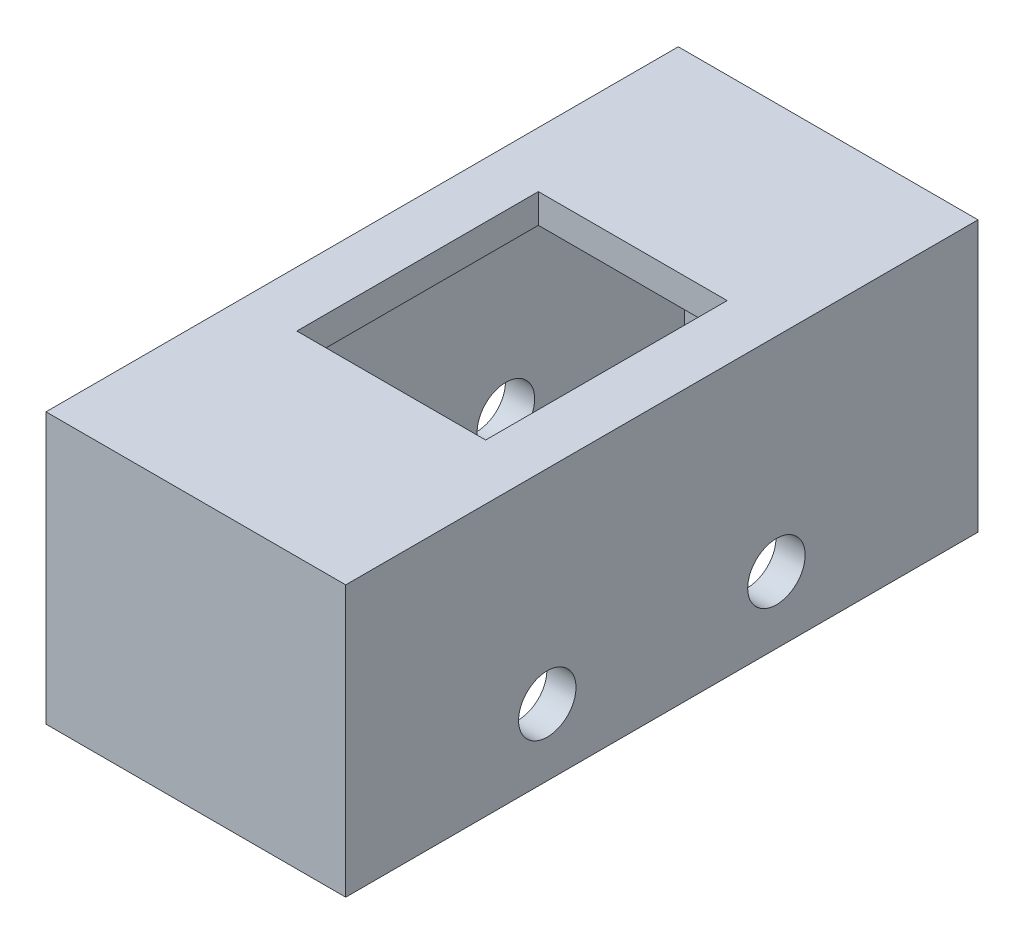
ISO-10303-21;
HEADER;
FILE_DESCRIPTION(('STEP AP214'),'2;1');
FILE_NAME('part.step','',(''),(''),'','','');
FILE_SCHEMA(('AUTOMOTIVE_DESIGN { 1 0 10303 214 1 1 1 1 }'));
ENDSEC;
DATA;
#1=APPLICATION_CONTEXT('core data for automotive mechanical design processes');
#2=APPLICATION_PROTOCOL_DEFINITION('international standard','automotive_design',2000,#1);
#3=PRODUCT_CONTEXT('',#1,'mechanical');
#4=PRODUCT('Part','Part','',(#3));
#5=PRODUCT_RELATED_PRODUCT_CATEGORY('part','',(#4));
#6=PRODUCT_DEFINITION_FORMATION('','',#4);
#7=PRODUCT_DEFINITION_CONTEXT('part definition',#1,'design');
#8=PRODUCT_DEFINITION('design','',#6,#7);
#9=PRODUCT_DEFINITION_SHAPE('','',#8);
#10=(LENGTH_UNIT() NAMED_UNIT(*) SI_UNIT(.MILLI.,.METRE.));
#11=(NAMED_UNIT(*) PLANE_ANGLE_UNIT() SI_UNIT($,.RADIAN.));
#12=(NAMED_UNIT(*) SI_UNIT($,.STERADIAN.) SOLID_ANGLE_UNIT());
#13=UNCERTAINTY_MEASURE_WITH_UNIT(LENGTH_MEASURE(1.E-05),#10,'distance_accuracy_value','');
#14=(GEOMETRIC_REPRESENTATION_CONTEXT(3) GLOBAL_UNCERTAINTY_ASSIGNED_CONTEXT((#13)) GLOBAL_UNIT_ASSIGNED_CONTEXT((#10,
#11,#12)) REPRESENTATION_CONTEXT('',''));
#15=CARTESIAN_POINT('',(0.,0.,0.));
#16=DIRECTION('',(0.,0.,1.));
#17=DIRECTION('',(1.,0.,0.));
#18=AXIS2_PLACEMENT_3D('',#15,#16,#17);
#19=CARTESIAN_POINT('',(-13.04,21.,-27.5083720930232));
#20=DIRECTION('',(0.,-1.,0.));
#21=DIRECTION('',(0.,0.,-1.));
#22=AXIS2_PLACEMENT_3D('',#19,#20,#21);
#23=PLANE('',#22);
#24=DIRECTION('',(0.,0.,-1.));
#25=VECTOR('',#24,1.);
#26=CARTESIAN_POINT('',(10.5,21.,-25.5));
#27=LINE('',#26,#25);
#28=CARTESIAN_POINT('',(10.5,21.,25.5));
#29=VERTEX_POINT('',#28);
#30=CARTESIAN_POINT('',(10.5,21.,-25.5));
#31=VERTEX_POINT('',#30);
#32=EDGE_CURVE('E167',#29,#31,#27,.T.);
#33=ORIENTED_EDGE('',*,*,#32,.F.);
#34=DIRECTION('',(1.,0.,0.));
#35=VECTOR('',#34,1.);
#36=CARTESIAN_POINT('',(-10.5,21.,25.5));
#37=LINE('',#36,#35);
#38=CARTESIAN_POINT('',(-10.5,21.,25.5));
#39=VERTEX_POINT('',#38);
#40=EDGE_CURVE('E177',#39,#29,#37,.T.);
#41=ORIENTED_EDGE('',*,*,#40,.F.);
#42=DIRECTION('',(0.,0.,1.));
#43=VECTOR('',#42,1.);
#44=CARTESIAN_POINT('',(-10.5,21.,-25.5));
#45=LINE('',#44,#43);
#46=CARTESIAN_POINT('',(-10.5,21.,-25.5));
#47=VERTEX_POINT('',#46);
#48=EDGE_CURVE('E174',#47,#39,#45,.T.);
#49=ORIENTED_EDGE('',*,*,#48,.F.);
#50=DIRECTION('',(-1.,0.,0.));
#51=VECTOR('',#50,1.);
#52=CARTESIAN_POINT('',(-10.5,21.,-25.5));
#53=LINE('',#52,#51);
#54=EDGE_CURVE('E170',#31,#47,#53,.T.);
#55=ORIENTED_EDGE('',*,*,#54,.F.);
#56=EDGE_LOOP('',(#33,#41,#49,#55));
#57=FACE_BOUND('',#56,.T.);
#58=DIRECTION('',(-1.,0.,0.));
#59=VECTOR('',#58,1.);
#60=CARTESIAN_POINT('',(-8.214,21.,-10.5083720930232));
#61=LINE('',#60,#59);
#62=CARTESIAN_POINT('',(8.21400000000001,21.,-10.5083720930232));
#63=VERTEX_POINT('',#62);
#64=CARTESIAN_POINT('',(-8.214,21.,-10.5083720930232));
#65=VERTEX_POINT('',#64);
#66=EDGE_CURVE('E137',#63,#65,#61,.T.);
#67=ORIENTED_EDGE('',*,*,#66,.T.);
#68=DIRECTION('',(0.,0.,1.));
#69=VECTOR('',#68,1.);
#70=CARTESIAN_POINT('',(-8.214,21.,-10.5083720930232));
#71=LINE('',#70,#69);
#72=CARTESIAN_POINT('',(-8.214,21.,10.5083720930232));
#73=VERTEX_POINT('',#72);
#74=EDGE_CURVE('E132',#65,#73,#71,.T.);
#75=ORIENTED_EDGE('',*,*,#74,.T.);
#76=DIRECTION('',(1.,0.,0.));
#77=VECTOR('',#76,1.);
#78=CARTESIAN_POINT('',(-8.214,21.,10.5083720930232));
#79=LINE('',#78,#77);
#80=CARTESIAN_POINT('',(8.21400000000001,21.,10.5083720930232));
#81=VERTEX_POINT('',#80);
#82=EDGE_CURVE('E121',#73,#81,#79,.T.);
#83=ORIENTED_EDGE('',*,*,#82,.T.);
#84=DIRECTION('',(0.,0.,-1.));
#85=VECTOR('',#84,1.);
#86=CARTESIAN_POINT('',(8.21400000000001,21.,-10.5083720930232));
#87=LINE('',#86,#85);
#88=EDGE_CURVE('E141',#81,#63,#87,.T.);
#89=ORIENTED_EDGE('',*,*,#88,.T.);
#90=EDGE_LOOP('',(#67,#75,#83,#89));
#91=FACE_BOUND('',#90,.T.);
#92=ADVANCED_FACE('F33',(#57,#91),#23,.T.);
#93=CARTESIAN_POINT('',(0.,0.,0.));
#94=DIRECTION('',(0.,-1.,0.));
#95=DIRECTION('',(0.,0.,-1.));
#96=AXIS2_PLACEMENT_3D('',#93,#94,#95);
#97=PLANE('',#96);
#98=DIRECTION('',(0.,0.,-1.));
#99=VECTOR('',#98,1.);
#100=CARTESIAN_POINT('',(13.04,0.,27.5083720930232));
#101=LINE('',#100,#99);
#102=CARTESIAN_POINT('',(13.04,0.,27.5083720930232));
#103=VERTEX_POINT('',#102);
#104=CARTESIAN_POINT('',(13.04,0.,-27.5083720930232));
#105=VERTEX_POINT('',#104);
#106=EDGE_CURVE('E200',#103,#105,#101,.T.);
#107=ORIENTED_EDGE('',*,*,#106,.F.);
#108=DIRECTION('',(1.,0.,0.));
#109=VECTOR('',#108,1.);
#110=CARTESIAN_POINT('',(-13.04,0.,27.5083720930232));
#111=LINE('',#110,#109);
#112=CARTESIAN_POINT('',(-13.04,0.,27.5083720930232));
#113=VERTEX_POINT('',#112);
#114=EDGE_CURVE('E207',#113,#103,#111,.T.);
#115=ORIENTED_EDGE('',*,*,#114,.F.);
#116=DIRECTION('',(0.,0.,1.));
#117=VECTOR('',#116,1.);
#118=CARTESIAN_POINT('',(-13.04,0.,27.5083720930232));
#119=LINE('',#118,#117);
#120=CARTESIAN_POINT('',(-13.04,0.,-27.5083720930232));
#121=VERTEX_POINT('',#120);
#122=EDGE_CURVE('E205',#121,#113,#119,.T.);
#123=ORIENTED_EDGE('',*,*,#122,.F.);
#124=DIRECTION('',(-1.,0.,0.));
#125=VECTOR('',#124,1.);
#126=CARTESIAN_POINT('',(-13.04,0.,-27.5083720930232));
#127=LINE('',#126,#125);
#128=EDGE_CURVE('E203',#105,#121,#127,.T.);
#129=ORIENTED_EDGE('',*,*,#128,.F.);
#130=EDGE_LOOP('',(#107,#115,#123,#129));
#131=FACE_BOUND('',#130,.T.);
#132=DIRECTION('',(1.,0.,0.));
#133=VECTOR('',#132,1.);
#134=CARTESIAN_POINT('',(-10.5,0.,25.5));
#135=LINE('',#134,#133);
#136=CARTESIAN_POINT('',(-10.5,0.,25.5));
#137=VERTEX_POINT('',#136);
#138=CARTESIAN_POINT('',(10.5,0.,25.5));
#139=VERTEX_POINT('',#138);
#140=EDGE_CURVE('E171',#137,#139,#135,.T.);
#141=ORIENTED_EDGE('',*,*,#140,.T.);
#142=DIRECTION('',(0.,0.,-1.));
#143=VECTOR('',#142,1.);
#144=CARTESIAN_POINT('',(10.5,0.,-25.5));
#145=LINE('',#144,#143);
#146=CARTESIAN_POINT('',(10.5,0.,-25.5));
#147=VERTEX_POINT('',#146);
#148=EDGE_CURVE('E164',#139,#147,#145,.T.);
#149=ORIENTED_EDGE('',*,*,#148,.T.);
#150=DIRECTION('',(-1.,0.,0.));
#151=VECTOR('',#150,1.);
#152=CARTESIAN_POINT('',(-10.5,0.,-25.5));
#153=LINE('',#152,#151);
#154=CARTESIAN_POINT('',(-10.5,0.,-25.5));
#155=VERTEX_POINT('',#154);
#156=EDGE_CURVE('E183',#147,#155,#153,.T.);
#157=ORIENTED_EDGE('',*,*,#156,.T.);
#158=DIRECTION('',(0.,0.,1.));
#159=VECTOR('',#158,1.);
#160=CARTESIAN_POINT('',(-10.5,0.,-25.5));
#161=LINE('',#160,#159);
#162=EDGE_CURVE('E186',#155,#137,#161,.T.);
#163=ORIENTED_EDGE('',*,*,#162,.T.);
#164=EDGE_LOOP('',(#141,#149,#157,#163));
#165=FACE_BOUND('',#164,.T.);
#166=ADVANCED_FACE('F224',(#131,#165),#97,.T.);
#167=CARTESIAN_POINT('',(13.04,21.,27.5083720930232));
#168=DIRECTION('',(-1.,0.,0.));
#169=DIRECTION('',(0.,0.,1.));
#170=AXIS2_PLACEMENT_3D('',#167,#168,#169);
#171=PLANE('',#170);
#172=CARTESIAN_POINT('',(13.04,5.8,-9.96837209302323));
#173=DIRECTION('',(-1.,0.,0.));
#174=DIRECTION('',(0.,0.,1.));
#175=AXIS2_PLACEMENT_3D('',#172,#173,#174);
#176=CIRCLE('',#175,2.5);
#177=CARTESIAN_POINT('',(13.04,5.8,-7.46837209302323));
#178=VERTEX_POINT('',#177);
#179=EDGE_CURVE('E426',#178,#178,#176,.T.);
#180=ORIENTED_EDGE('',*,*,#179,.T.);
#181=EDGE_LOOP('',(#180));
#182=FACE_BOUND('',#181,.T.);
#183=CARTESIAN_POINT('',(13.04,5.8,9.96837209302323));
#184=DIRECTION('',(-1.,0.,0.));
#185=DIRECTION('',(0.,0.,1.));
#186=AXIS2_PLACEMENT_3D('',#183,#184,#185);
#187=CIRCLE('',#186,2.5);
#188=CARTESIAN_POINT('',(13.04,5.8,12.4683720930232));
#189=VERTEX_POINT('',#188);
#190=EDGE_CURVE('E439',#189,#189,#187,.T.);
#191=ORIENTED_EDGE('',*,*,#190,.T.);
#192=EDGE_LOOP('',(#191));
#193=FACE_BOUND('',#192,.T.);
#194=ORIENTED_EDGE('',*,*,#106,.T.);
#195=DIRECTION('',(0.,-1.,0.));
#196=VECTOR('',#195,1.);
#197=CARTESIAN_POINT('',(13.04,21.,-27.5083720930232));
#198=LINE('',#197,#196);
#199=CARTESIAN_POINT('',(13.04,23.54,-27.5083720930232));
#200=VERTEX_POINT('',#199);
#201=EDGE_CURVE('E11',#200,#105,#198,.T.);
#202=ORIENTED_EDGE('',*,*,#201,.F.);
#203=DIRECTION('',(0.,0.,1.));
#204=VECTOR('',#203,1.);
#205=CARTESIAN_POINT('',(13.04,23.54,-27.5083720930232));
#206=LINE('',#205,#204);
#207=CARTESIAN_POINT('',(13.04,23.54,27.5083720930232));
#208=VERTEX_POINT('',#207);
#209=EDGE_CURVE('E158',#200,#208,#206,.T.);
#210=ORIENTED_EDGE('',*,*,#209,.T.);
#211=DIRECTION('',(0.,-1.,0.));
#212=VECTOR('',#211,1.);
#213=CARTESIAN_POINT('',(13.04,21.,27.5083720930232));
#214=LINE('',#213,#212);
#215=EDGE_CURVE('E209',#208,#103,#214,.T.);
#216=ORIENTED_EDGE('',*,*,#215,.T.);
#217=EDGE_LOOP('',(#194,#202,#210,#216));
#218=FACE_BOUND('',#217,.T.);
#219=ADVANCED_FACE('F35',(#182,#193,#218),#171,.F.);
#220=CARTESIAN_POINT('',(-13.04,21.,-27.5083720930232));
#221=DIRECTION('',(0.,0.,1.));
#222=DIRECTION('',(1.,0.,0.));
#223=AXIS2_PLACEMENT_3D('',#220,#221,#222);
#224=PLANE('',#223);
#225=ORIENTED_EDGE('',*,*,#128,.T.);
#226=DIRECTION('',(0.,-1.,0.));
#227=VECTOR('',#226,1.);
#228=CARTESIAN_POINT('',(-13.04,21.,-27.5083720930232));
#229=LINE('',#228,#227);
#230=CARTESIAN_POINT('',(-13.04,23.54,-27.5083720930232));
#231=VERTEX_POINT('',#230);
#232=EDGE_CURVE('E41',#231,#121,#229,.T.);
#233=ORIENTED_EDGE('',*,*,#232,.F.);
#234=DIRECTION('',(-1.,0.,0.));
#235=VECTOR('',#234,1.);
#236=CARTESIAN_POINT('',(-13.04,23.54,-27.5083720930232));
#237=LINE('',#236,#235);
#238=EDGE_CURVE('E155',#200,#231,#237,.T.);
#239=ORIENTED_EDGE('',*,*,#238,.F.);
#240=ORIENTED_EDGE('',*,*,#201,.T.);
#241=EDGE_LOOP('',(#225,#233,#239,#240));
#242=FACE_BOUND('',#241,.T.);
#243=ADVANCED_FACE('F233',(#242),#224,.F.);
#244=CARTESIAN_POINT('',(-13.04,21.,27.5083720930232));
#245=DIRECTION('',(1.,0.,0.));
#246=DIRECTION('',(0.,0.,-1.));
#247=AXIS2_PLACEMENT_3D('',#244,#245,#246);
#248=PLANE('',#247);
#249=CARTESIAN_POINT('',(-13.04,5.8,9.96837209302323));
#250=DIRECTION('',(1.,0.,0.));
#251=DIRECTION('',(0.,0.,-1.));
#252=AXIS2_PLACEMENT_3D('',#249,#250,#251);
#253=CIRCLE('',#252,2.5);
#254=CARTESIAN_POINT('',(-13.04,5.8,7.46837209302323));
#255=VERTEX_POINT('',#254);
#256=EDGE_CURVE('E441',#255,#255,#253,.F.);
#257=ORIENTED_EDGE('',*,*,#256,.F.);
#258=EDGE_LOOP('',(#257));
#259=FACE_BOUND('',#258,.T.);
#260=CARTESIAN_POINT('',(-13.04,5.8,-9.96837209302323));
#261=DIRECTION('',(1.,0.,0.));
#262=DIRECTION('',(0.,0.,-1.));
#263=AXIS2_PLACEMENT_3D('',#260,#261,#262);
#264=CIRCLE('',#263,2.5);
#265=CARTESIAN_POINT('',(-13.04,5.8,-12.4683720930232));
#266=VERTEX_POINT('',#265);
#267=EDGE_CURVE('E427',#266,#266,#264,.F.);
#268=ORIENTED_EDGE('',*,*,#267,.F.);
#269=EDGE_LOOP('',(#268));
#270=FACE_BOUND('',#269,.T.);
#271=ORIENTED_EDGE('',*,*,#122,.T.);
#272=DIRECTION('',(0.,-1.,0.));
#273=VECTOR('',#272,1.);
#274=CARTESIAN_POINT('',(-13.04,21.,27.5083720930232));
#275=LINE('',#274,#273);
#276=CARTESIAN_POINT('',(-13.04,23.54,27.5083720930232));
#277=VERTEX_POINT('',#276);
#278=EDGE_CURVE('E212',#277,#113,#275,.T.);
#279=ORIENTED_EDGE('',*,*,#278,.F.);
#280=DIRECTION('',(0.,0.,1.));
#281=VECTOR('',#280,1.);
#282=CARTESIAN_POINT('',(-13.04,23.54,-27.5083720930232));
#283=LINE('',#282,#281);
#284=EDGE_CURVE('E161',#231,#277,#283,.T.);
#285=ORIENTED_EDGE('',*,*,#284,.F.);
#286=ORIENTED_EDGE('',*,*,#232,.T.);
#287=EDGE_LOOP('',(#271,#279,#285,#286));
#288=FACE_BOUND('',#287,.T.);
#289=ADVANCED_FACE('F218',(#259,#270,#288),#248,.F.);
#290=CARTESIAN_POINT('',(-13.04,21.,27.5083720930232));
#291=DIRECTION('',(0.,0.,-1.));
#292=DIRECTION('',(-1.,0.,0.));
#293=AXIS2_PLACEMENT_3D('',#290,#291,#292);
#294=PLANE('',#293);
#295=ORIENTED_EDGE('',*,*,#114,.T.);
#296=ORIENTED_EDGE('',*,*,#215,.F.);
#297=DIRECTION('',(-1.,0.,0.));
#298=VECTOR('',#297,1.);
#299=CARTESIAN_POINT('',(-13.04,23.54,27.5083720930232));
#300=LINE('',#299,#298);
#301=EDGE_CURVE('E128',#208,#277,#300,.T.);
#302=ORIENTED_EDGE('',*,*,#301,.T.);
#303=ORIENTED_EDGE('',*,*,#278,.T.);
#304=EDGE_LOOP('',(#295,#296,#302,#303));
#305=FACE_BOUND('',#304,.T.);
#306=ADVANCED_FACE('F227',(#305),#294,.F.);
#307=CARTESIAN_POINT('',(10.5,21.,-25.5));
#308=DIRECTION('',(-1.,0.,0.));
#309=DIRECTION('',(0.,0.,1.));
#310=AXIS2_PLACEMENT_3D('',#307,#308,#309);
#311=PLANE('',#310);
#312=CARTESIAN_POINT('',(10.5,5.8,-9.96837209302323));
#313=DIRECTION('',(-1.,0.,0.));
#314=DIRECTION('',(0.,0.,1.));
#315=AXIS2_PLACEMENT_3D('',#312,#313,#314);
#316=CIRCLE('',#315,2.5);
#317=CARTESIAN_POINT('',(10.5,5.8,-7.46837209302323));
#318=VERTEX_POINT('',#317);
#319=EDGE_CURVE('E423',#318,#318,#316,.T.);
#320=ORIENTED_EDGE('',*,*,#319,.F.);
#321=EDGE_LOOP('',(#320));
#322=FACE_BOUND('',#321,.T.);
#323=CARTESIAN_POINT('',(10.5,5.8,9.96837209302323));
#324=DIRECTION('',(-1.,0.,0.));
#325=DIRECTION('',(0.,0.,1.));
#326=AXIS2_PLACEMENT_3D('',#323,#324,#325);
#327=CIRCLE('',#326,2.5);
#328=CARTESIAN_POINT('',(10.5,5.8,12.4683720930232));
#329=VERTEX_POINT('',#328);
#330=EDGE_CURVE('E436',#329,#329,#327,.T.);
#331=ORIENTED_EDGE('',*,*,#330,.F.);
#332=EDGE_LOOP('',(#331));
#333=FACE_BOUND('',#332,.T.);
#334=ORIENTED_EDGE('',*,*,#148,.F.);
#335=DIRECTION('',(0.,-1.,0.));
#336=VECTOR('',#335,1.);
#337=CARTESIAN_POINT('',(10.5,21.,25.5));
#338=LINE('',#337,#336);
#339=EDGE_CURVE('E180',#29,#139,#338,.T.);
#340=ORIENTED_EDGE('',*,*,#339,.F.);
#341=ORIENTED_EDGE('',*,*,#32,.T.);
#342=DIRECTION('',(0.,-1.,0.));
#343=VECTOR('',#342,1.);
#344=CARTESIAN_POINT('',(10.5,21.,-25.5));
#345=LINE('',#344,#343);
#346=EDGE_CURVE('E197',#31,#147,#345,.T.);
#347=ORIENTED_EDGE('',*,*,#346,.T.);
#348=EDGE_LOOP('',(#334,#340,#341,#347));
#349=FACE_BOUND('',#348,.T.);
#350=ADVANCED_FACE('F263',(#322,#333,#349),#311,.T.);
#351=CARTESIAN_POINT('',(-10.5,21.,-25.5));
#352=DIRECTION('',(0.,0.,1.));
#353=DIRECTION('',(1.,0.,0.));
#354=AXIS2_PLACEMENT_3D('',#351,#352,#353);
#355=PLANE('',#354);
#356=ORIENTED_EDGE('',*,*,#156,.F.);
#357=ORIENTED_EDGE('',*,*,#346,.F.);
#358=ORIENTED_EDGE('',*,*,#54,.T.);
#359=DIRECTION('',(0.,-1.,0.));
#360=VECTOR('',#359,1.);
#361=CARTESIAN_POINT('',(-10.5,21.,-25.5));
#362=LINE('',#361,#360);
#363=EDGE_CURVE('E195',#47,#155,#362,.T.);
#364=ORIENTED_EDGE('',*,*,#363,.T.);
#365=EDGE_LOOP('',(#356,#357,#358,#364));
#366=FACE_BOUND('',#365,.T.);
#367=ADVANCED_FACE('F259',(#366),#355,.T.);
#368=CARTESIAN_POINT('',(-10.5,21.,-25.5));
#369=DIRECTION('',(1.,0.,0.));
#370=DIRECTION('',(0.,0.,-1.));
#371=AXIS2_PLACEMENT_3D('',#368,#369,#370);
#372=PLANE('',#371);
#373=CARTESIAN_POINT('',(-10.5,5.8,9.96837209302323));
#374=DIRECTION('',(1.,0.,0.));
#375=DIRECTION('',(0.,0.,-1.));
#376=AXIS2_PLACEMENT_3D('',#373,#374,#375);
#377=CIRCLE('',#376,2.5);
#378=CARTESIAN_POINT('',(-10.5,5.8,7.46837209302323));
#379=VERTEX_POINT('',#378);
#380=EDGE_CURVE('E429',#379,#379,#377,.F.);
#381=ORIENTED_EDGE('',*,*,#380,.T.);
#382=EDGE_LOOP('',(#381));
#383=FACE_BOUND('',#382,.T.);
#384=CARTESIAN_POINT('',(-10.5,5.8,-9.96837209302323));
#385=DIRECTION('',(1.,0.,0.));
#386=DIRECTION('',(0.,0.,-1.));
#387=AXIS2_PLACEMENT_3D('',#384,#385,#386);
#388=CIRCLE('',#387,2.5);
#389=CARTESIAN_POINT('',(-10.5,5.8,-12.4683720930232));
#390=VERTEX_POINT('',#389);
#391=EDGE_CURVE('E432',#390,#390,#388,.F.);
#392=ORIENTED_EDGE('',*,*,#391,.T.);
#393=EDGE_LOOP('',(#392));
#394=FACE_BOUND('',#393,.T.);
#395=ORIENTED_EDGE('',*,*,#162,.F.);
#396=ORIENTED_EDGE('',*,*,#363,.F.);
#397=ORIENTED_EDGE('',*,*,#48,.T.);
#398=DIRECTION('',(0.,-1.,0.));
#399=VECTOR('',#398,1.);
#400=CARTESIAN_POINT('',(-10.5,21.,25.5));
#401=LINE('',#400,#399);
#402=EDGE_CURVE('E193',#39,#137,#401,.T.);
#403=ORIENTED_EDGE('',*,*,#402,.T.);
#404=EDGE_LOOP('',(#395,#396,#397,#403));
#405=FACE_BOUND('',#404,.T.);
#406=ADVANCED_FACE('F255',(#383,#394,#405),#372,.T.);
#407=CARTESIAN_POINT('',(-10.5,21.,25.5));
#408=DIRECTION('',(0.,0.,-1.));
#409=DIRECTION('',(-1.,0.,0.));
#410=AXIS2_PLACEMENT_3D('',#407,#408,#409);
#411=PLANE('',#410);
#412=ORIENTED_EDGE('',*,*,#140,.F.);
#413=ORIENTED_EDGE('',*,*,#402,.F.);
#414=ORIENTED_EDGE('',*,*,#40,.T.);
#415=ORIENTED_EDGE('',*,*,#339,.T.);
#416=EDGE_LOOP('',(#412,#413,#414,#415));
#417=FACE_BOUND('',#416,.T.);
#418=ADVANCED_FACE('F252',(#417),#411,.T.);
#419=CARTESIAN_POINT('',(-13.04,23.54,-27.5083720930232));
#420=DIRECTION('',(0.,1.,0.));
#421=DIRECTION('',(0.,0.,1.));
#422=AXIS2_PLACEMENT_3D('',#419,#420,#421);
#423=PLANE('',#422);
#424=DIRECTION('',(0.,0.,1.));
#425=VECTOR('',#424,1.);
#426=CARTESIAN_POINT('',(-8.214,23.54,-10.5083720930232));
#427=LINE('',#426,#425);
#428=CARTESIAN_POINT('',(-8.214,23.54,-10.5083720930232));
#429=VERTEX_POINT('',#428);
#430=CARTESIAN_POINT('',(-8.214,23.54,10.5083720930232));
#431=VERTEX_POINT('',#430);
#432=EDGE_CURVE('E56',#429,#431,#427,.T.);
#433=ORIENTED_EDGE('',*,*,#432,.F.);
#434=DIRECTION('',(-1.,0.,0.));
#435=VECTOR('',#434,1.);
#436=CARTESIAN_POINT('',(-8.214,23.54,-10.5083720930232));
#437=LINE('',#436,#435);
#438=CARTESIAN_POINT('',(8.21400000000001,23.54,-10.5083720930232));
#439=VERTEX_POINT('',#438);
#440=EDGE_CURVE('E134',#439,#429,#437,.T.);
#441=ORIENTED_EDGE('',*,*,#440,.F.);
#442=DIRECTION('',(0.,0.,-1.));
#443=VECTOR('',#442,1.);
#444=CARTESIAN_POINT('',(8.21400000000001,23.54,-10.5083720930232));
#445=LINE('',#444,#443);
#446=CARTESIAN_POINT('',(8.21400000000001,23.54,10.5083720930232));
#447=VERTEX_POINT('',#446);
#448=EDGE_CURVE('E146',#447,#439,#445,.T.);
#449=ORIENTED_EDGE('',*,*,#448,.F.);
#450=DIRECTION('',(1.,0.,0.));
#451=VECTOR('',#450,1.);
#452=CARTESIAN_POINT('',(-8.214,23.54,10.5083720930232));
#453=LINE('',#452,#451);
#454=EDGE_CURVE('E139',#431,#447,#453,.T.);
#455=ORIENTED_EDGE('',*,*,#454,.F.);
#456=EDGE_LOOP('',(#433,#441,#449,#455));
#457=FACE_BOUND('',#456,.T.);
#458=ORIENTED_EDGE('',*,*,#301,.F.);
#459=ORIENTED_EDGE('',*,*,#209,.F.);
#460=ORIENTED_EDGE('',*,*,#238,.T.);
#461=ORIENTED_EDGE('',*,*,#284,.T.);
#462=EDGE_LOOP('',(#458,#459,#460,#461));
#463=FACE_BOUND('',#462,.T.);
#464=ADVANCED_FACE('F232',(#457,#463),#423,.T.);
#465=CARTESIAN_POINT('',(-8.214,-0.001000000000001,-10.5083720930232));
#466=DIRECTION('',(-1.,0.,0.));
#467=DIRECTION('',(0.,0.,1.));
#468=AXIS2_PLACEMENT_3D('',#465,#466,#467);
#469=PLANE('',#468);
#470=DIRECTION('',(0.,1.,0.));
#471=VECTOR('',#470,1.);
#472=CARTESIAN_POINT('',(-8.214,-0.001000000000001,-10.5083720930232));
#473=LINE('',#472,#471);
#474=EDGE_CURVE('E129',#65,#429,#473,.T.);
#475=ORIENTED_EDGE('',*,*,#474,.T.);
#476=ORIENTED_EDGE('',*,*,#432,.T.);
#477=DIRECTION('',(0.,1.,0.));
#478=VECTOR('',#477,1.);
#479=CARTESIAN_POINT('',(-8.214,-0.001000000000001,10.5083720930232));
#480=LINE('',#479,#478);
#481=EDGE_CURVE('E123',#73,#431,#480,.T.);
#482=ORIENTED_EDGE('',*,*,#481,.F.);
#483=ORIENTED_EDGE('',*,*,#74,.F.);
#484=EDGE_LOOP('',(#475,#476,#482,#483));
#485=FACE_BOUND('',#484,.T.);
#486=ADVANCED_FACE('F131',(#485),#469,.F.);
#487=CARTESIAN_POINT('',(-8.214,-0.001000000000001,-10.5083720930232));
#488=DIRECTION('',(0.,0.,-1.));
#489=DIRECTION('',(-1.,0.,0.));
#490=AXIS2_PLACEMENT_3D('',#487,#488,#489);
#491=PLANE('',#490);
#492=DIRECTION('',(0.,1.,0.));
#493=VECTOR('',#492,1.);
#494=CARTESIAN_POINT('',(8.21400000000001,-0.001000000000001,-10.5083720930232));
#495=LINE('',#494,#493);
#496=EDGE_CURVE('E152',#63,#439,#495,.T.);
#497=ORIENTED_EDGE('',*,*,#496,.T.);
#498=ORIENTED_EDGE('',*,*,#440,.T.);
#499=ORIENTED_EDGE('',*,*,#474,.F.);
#500=ORIENTED_EDGE('',*,*,#66,.F.);
#501=EDGE_LOOP('',(#497,#498,#499,#500));
#502=FACE_BOUND('',#501,.T.);
#503=ADVANCED_FACE('F302',(#502),#491,.F.);
#504=CARTESIAN_POINT('',(8.21400000000001,-0.001000000000001,-10.5083720930232));
#505=DIRECTION('',(1.,0.,0.));
#506=DIRECTION('',(0.,0.,-1.));
#507=AXIS2_PLACEMENT_3D('',#504,#505,#506);
#508=PLANE('',#507);
#509=DIRECTION('',(0.,1.,0.));
#510=VECTOR('',#509,1.);
#511=CARTESIAN_POINT('',(8.21400000000001,-0.001000000000001,10.5083720930232));
#512=LINE('',#511,#510);
#513=EDGE_CURVE('E48',#81,#447,#512,.T.);
#514=ORIENTED_EDGE('',*,*,#513,.T.);
#515=ORIENTED_EDGE('',*,*,#448,.T.);
#516=ORIENTED_EDGE('',*,*,#496,.F.);
#517=ORIENTED_EDGE('',*,*,#88,.F.);
#518=EDGE_LOOP('',(#514,#515,#516,#517));
#519=FACE_BOUND('',#518,.T.);
#520=ADVANCED_FACE('F308',(#519),#508,.F.);
#521=CARTESIAN_POINT('',(-8.214,-0.001000000000001,10.5083720930232));
#522=DIRECTION('',(0.,0.,1.));
#523=DIRECTION('',(1.,0.,0.));
#524=AXIS2_PLACEMENT_3D('',#521,#522,#523);
#525=PLANE('',#524);
#526=ORIENTED_EDGE('',*,*,#481,.T.);
#527=ORIENTED_EDGE('',*,*,#454,.T.);
#528=ORIENTED_EDGE('',*,*,#513,.F.);
#529=ORIENTED_EDGE('',*,*,#82,.F.);
#530=EDGE_LOOP('',(#526,#527,#528,#529));
#531=FACE_BOUND('',#530,.T.);
#532=ADVANCED_FACE('F122',(#531),#525,.F.);
#533=CARTESIAN_POINT('',(-13.041,5.8,-9.96837209302323));
#534=DIRECTION('',(1.,0.,0.));
#535=DIRECTION('',(0.,0.,-1.));
#536=AXIS2_PLACEMENT_3D('',#533,#534,#535);
#537=CYLINDRICAL_SURFACE('',#536,2.5);
#538=CARTESIAN_POINT('',(-10.5,5.8,-12.4683720930232));
#539=CARTESIAN_POINT('',(-10.5264583333333,5.8,-12.4683720930232));
#540=CARTESIAN_POINT('',(-10.5529166666667,5.8,-12.4683720930232));
#541=CARTESIAN_POINT('',(-10.6058333333333,5.8,-12.4683720930232));
#542=CARTESIAN_POINT('',(-10.6322916666667,5.8,-12.4683720930232));
#543=CARTESIAN_POINT('',(-10.6852083333333,5.8,-12.4683720930232));
#544=CARTESIAN_POINT('',(-10.7116666666667,5.8,-12.4683720930232));
#545=CARTESIAN_POINT('',(-10.7645833333333,5.8,-12.4683720930232));
#546=CARTESIAN_POINT('',(-10.7910416666667,5.8,-12.4683720930232));
#547=CARTESIAN_POINT('',(-10.8439583333333,5.8,-12.4683720930232));
#548=CARTESIAN_POINT('',(-10.8704166666667,5.8,-12.4683720930232));
#549=CARTESIAN_POINT('',(-10.9233333333333,5.8,-12.4683720930232));
#550=CARTESIAN_POINT('',(-10.9497916666667,5.8,-12.4683720930232));
#551=CARTESIAN_POINT('',(-11.0027083333333,5.8,-12.4683720930232));
#552=CARTESIAN_POINT('',(-11.0291666666667,5.8,-12.4683720930232));
#553=CARTESIAN_POINT('',(-11.0820833333333,5.8,-12.4683720930232));
#554=CARTESIAN_POINT('',(-11.1085416666667,5.8,-12.4683720930232));
#555=CARTESIAN_POINT('',(-11.1614583333333,5.8,-12.4683720930232));
#556=CARTESIAN_POINT('',(-11.1879166666667,5.8,-12.4683720930232));
#557=CARTESIAN_POINT('',(-11.2408333333333,5.8,-12.4683720930232));
#558=CARTESIAN_POINT('',(-11.2672916666667,5.8,-12.4683720930232));
#559=CARTESIAN_POINT('',(-11.3202083333333,5.8,-12.4683720930232));
#560=CARTESIAN_POINT('',(-11.3466666666667,5.8,-12.4683720930232));
#561=CARTESIAN_POINT('',(-11.3995833333333,5.8,-12.4683720930232));
#562=CARTESIAN_POINT('',(-11.4260416666667,5.8,-12.4683720930232));
#563=CARTESIAN_POINT('',(-11.4789583333333,5.8,-12.4683720930232));
#564=CARTESIAN_POINT('',(-11.5054166666667,5.8,-12.4683720930232));
#565=CARTESIAN_POINT('',(-11.5583333333333,5.8,-12.4683720930232));
#566=CARTESIAN_POINT('',(-11.5847916666667,5.8,-12.4683720930232));
#567=CARTESIAN_POINT('',(-11.6377083333333,5.8,-12.4683720930232));
#568=CARTESIAN_POINT('',(-11.6641666666667,5.8,-12.4683720930232));
#569=CARTESIAN_POINT('',(-11.7170833333333,5.8,-12.4683720930232));
#570=CARTESIAN_POINT('',(-11.7435416666667,5.8,-12.4683720930232));
#571=CARTESIAN_POINT('',(-11.7964583333333,5.8,-12.4683720930232));
#572=CARTESIAN_POINT('',(-11.8229166666667,5.8,-12.4683720930232));
#573=CARTESIAN_POINT('',(-11.8758333333333,5.8,-12.4683720930232));
#574=CARTESIAN_POINT('',(-11.9022916666667,5.8,-12.4683720930232));
#575=CARTESIAN_POINT('',(-11.9552083333333,5.8,-12.4683720930232));
#576=CARTESIAN_POINT('',(-11.9816666666667,5.8,-12.4683720930232));
#577=CARTESIAN_POINT('',(-12.0345833333333,5.8,-12.4683720930232));
#578=CARTESIAN_POINT('',(-12.0610416666667,5.8,-12.4683720930232));
#579=CARTESIAN_POINT('',(-12.1139583333333,5.8,-12.4683720930232));
#580=CARTESIAN_POINT('',(-12.1404166666667,5.8,-12.4683720930232));
#581=CARTESIAN_POINT('',(-12.1933333333333,5.8,-12.4683720930232));
#582=CARTESIAN_POINT('',(-12.2197916666667,5.8,-12.4683720930232));
#583=CARTESIAN_POINT('',(-12.2727083333333,5.8,-12.4683720930232));
#584=CARTESIAN_POINT('',(-12.2991666666667,5.8,-12.4683720930232));
#585=CARTESIAN_POINT('',(-12.3520833333333,5.8,-12.4683720930232));
#586=CARTESIAN_POINT('',(-12.3785416666667,5.8,-12.4683720930232));
#587=CARTESIAN_POINT('',(-12.4314583333333,5.8,-12.4683720930232));
#588=CARTESIAN_POINT('',(-12.4579166666667,5.8,-12.4683720930232));
#589=CARTESIAN_POINT('',(-12.5108333333333,5.8,-12.4683720930232));
#590=CARTESIAN_POINT('',(-12.5372916666667,5.8,-12.4683720930232));
#591=CARTESIAN_POINT('',(-12.5902083333333,5.8,-12.4683720930232));
#592=CARTESIAN_POINT('',(-12.6166666666667,5.8,-12.4683720930232));
#593=CARTESIAN_POINT('',(-12.6695833333333,5.8,-12.4683720930232));
#594=CARTESIAN_POINT('',(-12.6960416666667,5.8,-12.4683720930232));
#595=CARTESIAN_POINT('',(-12.7489583333333,5.8,-12.4683720930232));
#596=CARTESIAN_POINT('',(-12.7754166666667,5.8,-12.4683720930232));
#597=CARTESIAN_POINT('',(-12.8283333333333,5.8,-12.4683720930232));
#598=CARTESIAN_POINT('',(-12.8547916666667,5.8,-12.4683720930232));
#599=CARTESIAN_POINT('',(-12.9077083333333,5.8,-12.4683720930232));
#600=CARTESIAN_POINT('',(-12.9341666666667,5.8,-12.4683720930232));
#601=CARTESIAN_POINT('',(-12.9870833333333,5.8,-12.4683720930232));
#602=CARTESIAN_POINT('',(-13.0135416666667,5.8,-12.4683720930232));
#603=CARTESIAN_POINT('',(-13.04,5.8,-12.4683720930232));
#604=B_SPLINE_CURVE_WITH_KNOTS('',3,(#538,#539,#540,#541,#542,#543,#544,#545,#546,#547,#548,
#549,#550,#551,#552,#553,#554,#555,#556,#557,#558,#559,#560,#561,#562,#563,#564,#565,#566,#567,
#568,#569,#570,#571,#572,#573,#574,#575,#576,#577,#578,#579,#580,#581,#582,#583,#584,#585,#586,
#587,#588,#589,#590,#591,#592,#593,#594,#595,#596,#597,#598,#599,#600,#601,#602,#603),
.UNSPECIFIED.,.F.,.F.,(4,2,2,2,2,2,2,2,2,2,2,2,2,2,2,2,2,2,2,2,2,2,2,2,2,2,2,2,2,2,2,2,4),(0.,
0.0793750000000013,0.158750000000001,0.238125,0.317500000000002,0.396875000000001,
0.476250000000001,0.555625000000001,0.635,0.714375,0.793750000000001,0.873125000000001,0.9525,
1.031875,1.11125,1.190625,1.27,1.349375,1.42875,1.508125,1.5875,1.666875,1.74625,1.825625,1.905,
1.984375,2.06375,2.143125,2.2225,2.301875,2.38125,2.460625,2.54),.UNSPECIFIED.);
#605=EDGE_CURVE('BSEAM323',#390,#266,#604,.T.);
#606=ORIENTED_EDGE('',*,*,#391,.F.);
#607=ORIENTED_EDGE('',*,*,#267,.T.);
#608=ORIENTED_EDGE('',*,*,#605,.T.);
#609=ORIENTED_EDGE('',*,*,#605,.F.);
#610=EDGE_LOOP('',(#606,#608,#607,#609));
#611=FACE_BOUND('',#610,.T.);
#612=ADVANCED_FACE('F323',(#611),#537,.F.);
#613=CARTESIAN_POINT('',(-13.041,5.8,9.96837209302323));
#614=DIRECTION('',(1.,0.,0.));
#615=DIRECTION('',(0.,0.,-1.));
#616=AXIS2_PLACEMENT_3D('',#613,#614,#615);
#617=CYLINDRICAL_SURFACE('',#616,2.5);
#618=CARTESIAN_POINT('',(-10.5,5.8,7.46837209302323));
#619=CARTESIAN_POINT('',(-10.5264583333333,5.8,7.46837209302323));
#620=CARTESIAN_POINT('',(-10.5529166666667,5.8,7.46837209302323));
#621=CARTESIAN_POINT('',(-10.6058333333333,5.8,7.46837209302323));
#622=CARTESIAN_POINT('',(-10.6322916666667,5.8,7.46837209302323));
#623=CARTESIAN_POINT('',(-10.6852083333333,5.8,7.46837209302323));
#624=CARTESIAN_POINT('',(-10.7116666666667,5.8,7.46837209302323));
#625=CARTESIAN_POINT('',(-10.7645833333333,5.8,7.46837209302323));
#626=CARTESIAN_POINT('',(-10.7910416666667,5.8,7.46837209302323));
#627=CARTESIAN_POINT('',(-10.8439583333333,5.8,7.46837209302323));
#628=CARTESIAN_POINT('',(-10.8704166666667,5.8,7.46837209302323));
#629=CARTESIAN_POINT('',(-10.9233333333333,5.8,7.46837209302323));
#630=CARTESIAN_POINT('',(-10.9497916666667,5.8,7.46837209302323));
#631=CARTESIAN_POINT('',(-11.0027083333333,5.8,7.46837209302323));
#632=CARTESIAN_POINT('',(-11.0291666666667,5.8,7.46837209302323));
#633=CARTESIAN_POINT('',(-11.0820833333333,5.8,7.46837209302323));
#634=CARTESIAN_POINT('',(-11.1085416666667,5.8,7.46837209302323));
#635=CARTESIAN_POINT('',(-11.1614583333333,5.8,7.46837209302323));
#636=CARTESIAN_POINT('',(-11.1879166666667,5.8,7.46837209302323));
#637=CARTESIAN_POINT('',(-11.2408333333333,5.8,7.46837209302323));
#638=CARTESIAN_POINT('',(-11.2672916666667,5.8,7.46837209302323));
#639=CARTESIAN_POINT('',(-11.3202083333333,5.8,7.46837209302323));
#640=CARTESIAN_POINT('',(-11.3466666666667,5.8,7.46837209302323));
#641=CARTESIAN_POINT('',(-11.3995833333333,5.8,7.46837209302323));
#642=CARTESIAN_POINT('',(-11.4260416666667,5.8,7.46837209302323));
#643=CARTESIAN_POINT('',(-11.4789583333333,5.8,7.46837209302323));
#644=CARTESIAN_POINT('',(-11.5054166666667,5.8,7.46837209302323));
#645=CARTESIAN_POINT('',(-11.5583333333333,5.8,7.46837209302323));
#646=CARTESIAN_POINT('',(-11.5847916666667,5.8,7.46837209302323));
#647=CARTESIAN_POINT('',(-11.6377083333333,5.8,7.46837209302323));
#648=CARTESIAN_POINT('',(-11.6641666666667,5.8,7.46837209302323));
#649=CARTESIAN_POINT('',(-11.7170833333333,5.8,7.46837209302323));
#650=CARTESIAN_POINT('',(-11.7435416666667,5.8,7.46837209302323));
#651=CARTESIAN_POINT('',(-11.7964583333333,5.8,7.46837209302323));
#652=CARTESIAN_POINT('',(-11.8229166666667,5.8,7.46837209302323));
#653=CARTESIAN_POINT('',(-11.8758333333333,5.8,7.46837209302323));
#654=CARTESIAN_POINT('',(-11.9022916666667,5.8,7.46837209302323));
#655=CARTESIAN_POINT('',(-11.9552083333333,5.8,7.46837209302323));
#656=CARTESIAN_POINT('',(-11.9816666666667,5.8,7.46837209302323));
#657=CARTESIAN_POINT('',(-12.0345833333333,5.8,7.46837209302323));
#658=CARTESIAN_POINT('',(-12.0610416666667,5.8,7.46837209302323));
#659=CARTESIAN_POINT('',(-12.1139583333333,5.8,7.46837209302323));
#660=CARTESIAN_POINT('',(-12.1404166666667,5.8,7.46837209302323));
#661=CARTESIAN_POINT('',(-12.1933333333333,5.8,7.46837209302323));
#662=CARTESIAN_POINT('',(-12.2197916666667,5.8,7.46837209302323));
#663=CARTESIAN_POINT('',(-12.2727083333333,5.8,7.46837209302323));
#664=CARTESIAN_POINT('',(-12.2991666666667,5.8,7.46837209302323));
#665=CARTESIAN_POINT('',(-12.3520833333333,5.8,7.46837209302323));
#666=CARTESIAN_POINT('',(-12.3785416666667,5.8,7.46837209302323));
#667=CARTESIAN_POINT('',(-12.4314583333333,5.8,7.46837209302323));
#668=CARTESIAN_POINT('',(-12.4579166666667,5.8,7.46837209302323));
#669=CARTESIAN_POINT('',(-12.5108333333333,5.8,7.46837209302323));
#670=CARTESIAN_POINT('',(-12.5372916666667,5.8,7.46837209302323));
#671=CARTESIAN_POINT('',(-12.5902083333333,5.8,7.46837209302323));
#672=CARTESIAN_POINT('',(-12.6166666666667,5.8,7.46837209302323));
#673=CARTESIAN_POINT('',(-12.6695833333333,5.8,7.46837209302323));
#674=CARTESIAN_POINT('',(-12.6960416666667,5.8,7.46837209302323));
#675=CARTESIAN_POINT('',(-12.7489583333333,5.8,7.46837209302323));
#676=CARTESIAN_POINT('',(-12.7754166666667,5.8,7.46837209302323));
#677=CARTESIAN_POINT('',(-12.8283333333333,5.8,7.46837209302323));
#678=CARTESIAN_POINT('',(-12.8547916666667,5.8,7.46837209302323));
#679=CARTESIAN_POINT('',(-12.9077083333333,5.8,7.46837209302323));
#680=CARTESIAN_POINT('',(-12.9341666666667,5.8,7.46837209302323));
#681=CARTESIAN_POINT('',(-12.9870833333333,5.8,7.46837209302323));
#682=CARTESIAN_POINT('',(-13.0135416666667,5.8,7.46837209302323));
#683=CARTESIAN_POINT('',(-13.04,5.8,7.46837209302323));
#684=B_SPLINE_CURVE_WITH_KNOTS('',3,(#618,#619,#620,#621,#622,#623,#624,#625,#626,#627,#628,
#629,#630,#631,#632,#633,#634,#635,#636,#637,#638,#639,#640,#641,#642,#643,#644,#645,#646,#647,
#648,#649,#650,#651,#652,#653,#654,#655,#656,#657,#658,#659,#660,#661,#662,#663,#664,#665,#666,
#667,#668,#669,#670,#671,#672,#673,#674,#675,#676,#677,#678,#679,#680,#681,#682,#683),
.UNSPECIFIED.,.F.,.F.,(4,2,2,2,2,2,2,2,2,2,2,2,2,2,2,2,2,2,2,2,2,2,2,2,2,2,2,2,2,2,2,2,4),(0.,
0.0793750000000013,0.158750000000001,0.238125,0.317500000000002,0.396875000000001,
0.476250000000001,0.555625000000001,0.635000000000002,0.714375000000001,0.793750000000001,
0.873125000000002,0.952500000000002,1.031875,1.11125,1.190625,1.27,1.349375,1.42875,1.508125,
1.5875,1.666875,1.74625,1.825625,1.905,1.984375,2.06375,2.143125,2.2225,2.301875,2.38125,
2.460625,2.54),.UNSPECIFIED.);
#685=EDGE_CURVE('BSEAM330',#379,#255,#684,.T.);
#686=ORIENTED_EDGE('',*,*,#380,.F.);
#687=ORIENTED_EDGE('',*,*,#256,.T.);
#688=ORIENTED_EDGE('',*,*,#685,.T.);
#689=ORIENTED_EDGE('',*,*,#685,.F.);
#690=EDGE_LOOP('',(#686,#688,#687,#689));
#691=FACE_BOUND('',#690,.T.);
#692=ADVANCED_FACE('F330',(#691),#617,.F.);
#693=CARTESIAN_POINT('',(13.041,5.8,9.96837209302323));
#694=DIRECTION('',(-1.,0.,0.));
#695=DIRECTION('',(0.,0.,1.));
#696=AXIS2_PLACEMENT_3D('',#693,#694,#695);
#697=CYLINDRICAL_SURFACE('',#696,2.5);
#698=CARTESIAN_POINT('',(10.5,5.8,12.4683720930232));
#699=CARTESIAN_POINT('',(10.5264583333333,5.8,12.4683720930232));
#700=CARTESIAN_POINT('',(10.5529166666667,5.8,12.4683720930232));
#701=CARTESIAN_POINT('',(10.6058333333333,5.8,12.4683720930232));
#702=CARTESIAN_POINT('',(10.6322916666667,5.8,12.4683720930232));
#703=CARTESIAN_POINT('',(10.6852083333333,5.8,12.4683720930232));
#704=CARTESIAN_POINT('',(10.7116666666667,5.8,12.4683720930232));
#705=CARTESIAN_POINT('',(10.7645833333333,5.8,12.4683720930232));
#706=CARTESIAN_POINT('',(10.7910416666667,5.8,12.4683720930232));
#707=CARTESIAN_POINT('',(10.8439583333333,5.8,12.4683720930232));
#708=CARTESIAN_POINT('',(10.8704166666667,5.8,12.4683720930232));
#709=CARTESIAN_POINT('',(10.9233333333333,5.8,12.4683720930232));
#710=CARTESIAN_POINT('',(10.9497916666667,5.8,12.4683720930232));
#711=CARTESIAN_POINT('',(11.0027083333333,5.8,12.4683720930232));
#712=CARTESIAN_POINT('',(11.0291666666667,5.8,12.4683720930232));
#713=CARTESIAN_POINT('',(11.0820833333333,5.8,12.4683720930232));
#714=CARTESIAN_POINT('',(11.1085416666667,5.8,12.4683720930232));
#715=CARTESIAN_POINT('',(11.1614583333333,5.8,12.4683720930232));
#716=CARTESIAN_POINT('',(11.1879166666667,5.8,12.4683720930232));
#717=CARTESIAN_POINT('',(11.2408333333333,5.8,12.4683720930232));
#718=CARTESIAN_POINT('',(11.2672916666667,5.8,12.4683720930232));
#719=CARTESIAN_POINT('',(11.3202083333333,5.8,12.4683720930232));
#720=CARTESIAN_POINT('',(11.3466666666667,5.8,12.4683720930232));
#721=CARTESIAN_POINT('',(11.3995833333333,5.8,12.4683720930232));
#722=CARTESIAN_POINT('',(11.4260416666667,5.8,12.4683720930232));
#723=CARTESIAN_POINT('',(11.4789583333333,5.8,12.4683720930232));
#724=CARTESIAN_POINT('',(11.5054166666667,5.8,12.4683720930232));
#725=CARTESIAN_POINT('',(11.5583333333333,5.8,12.4683720930232));
#726=CARTESIAN_POINT('',(11.5847916666667,5.8,12.4683720930232));
#727=CARTESIAN_POINT('',(11.6377083333333,5.8,12.4683720930232));
#728=CARTESIAN_POINT('',(11.6641666666667,5.8,12.4683720930232));
#729=CARTESIAN_POINT('',(11.7170833333333,5.8,12.4683720930232));
#730=CARTESIAN_POINT('',(11.7435416666667,5.8,12.4683720930232));
#731=CARTESIAN_POINT('',(11.7964583333333,5.8,12.4683720930232));
#732=CARTESIAN_POINT('',(11.8229166666667,5.8,12.4683720930232));
#733=CARTESIAN_POINT('',(11.8758333333333,5.8,12.4683720930232));
#734=CARTESIAN_POINT('',(11.9022916666667,5.8,12.4683720930232));
#735=CARTESIAN_POINT('',(11.9552083333333,5.8,12.4683720930232));
#736=CARTESIAN_POINT('',(11.9816666666667,5.8,12.4683720930232));
#737=CARTESIAN_POINT('',(12.0345833333333,5.8,12.4683720930232));
#738=CARTESIAN_POINT('',(12.0610416666667,5.8,12.4683720930232));
#739=CARTESIAN_POINT('',(12.1139583333333,5.8,12.4683720930232));
#740=CARTESIAN_POINT('',(12.1404166666667,5.8,12.4683720930232));
#741=CARTESIAN_POINT('',(12.1933333333333,5.8,12.4683720930232));
#742=CARTESIAN_POINT('',(12.2197916666667,5.8,12.4683720930232));
#743=CARTESIAN_POINT('',(12.2727083333333,5.8,12.4683720930232));
#744=CARTESIAN_POINT('',(12.2991666666667,5.8,12.4683720930232));
#745=CARTESIAN_POINT('',(12.3520833333333,5.8,12.4683720930232));
#746=CARTESIAN_POINT('',(12.3785416666667,5.8,12.4683720930232));
#747=CARTESIAN_POINT('',(12.4314583333333,5.8,12.4683720930232));
#748=CARTESIAN_POINT('',(12.4579166666667,5.8,12.4683720930232));
#749=CARTESIAN_POINT('',(12.5108333333333,5.8,12.4683720930232));
#750=CARTESIAN_POINT('',(12.5372916666667,5.8,12.4683720930232));
#751=CARTESIAN_POINT('',(12.5902083333333,5.8,12.4683720930232));
#752=CARTESIAN_POINT('',(12.6166666666667,5.8,12.4683720930232));
#753=CARTESIAN_POINT('',(12.6695833333333,5.8,12.4683720930232));
#754=CARTESIAN_POINT('',(12.6960416666667,5.8,12.4683720930232));
#755=CARTESIAN_POINT('',(12.7489583333333,5.8,12.4683720930232));
#756=CARTESIAN_POINT('',(12.7754166666667,5.8,12.4683720930232));
#757=CARTESIAN_POINT('',(12.8283333333333,5.8,12.4683720930232));
#758=CARTESIAN_POINT('',(12.8547916666667,5.8,12.4683720930232));
#759=CARTESIAN_POINT('',(12.9077083333333,5.8,12.4683720930232));
#760=CARTESIAN_POINT('',(12.9341666666667,5.8,12.4683720930232));
#761=CARTESIAN_POINT('',(12.9870833333333,5.8,12.4683720930232));
#762=CARTESIAN_POINT('',(13.0135416666667,5.8,12.4683720930232));
#763=CARTESIAN_POINT('',(13.04,5.8,12.4683720930232));
#764=B_SPLINE_CURVE_WITH_KNOTS('',3,(#698,#699,#700,#701,#702,#703,#704,#705,#706,#707,#708,
#709,#710,#711,#712,#713,#714,#715,#716,#717,#718,#719,#720,#721,#722,#723,#724,#725,#726,#727,
#728,#729,#730,#731,#732,#733,#734,#735,#736,#737,#738,#739,#740,#741,#742,#743,#744,#745,#746,
#747,#748,#749,#750,#751,#752,#753,#754,#755,#756,#757,#758,#759,#760,#761,#762,#763),
.UNSPECIFIED.,.F.,.F.,(4,2,2,2,2,2,2,2,2,2,2,2,2,2,2,2,2,2,2,2,2,2,2,2,2,2,2,2,2,2,2,2,4),(0.,
0.0793750000000013,0.158750000000001,0.238125000000002,0.317500000000002,0.396875000000001,
0.476250000000001,0.555625000000002,0.635000000000002,0.714375000000003,0.793750000000003,
0.873125000000002,0.952500000000004,1.031875,1.11125,1.190625,1.27,1.349375,1.42875,1.508125,
1.5875,1.66687500000001,1.74625,1.825625,1.90500000000001,1.98437500000001,2.06375000000001,
2.14312500000001,2.22250000000001,2.30187500000001,2.38125000000001,2.46062500000001,
2.54000000000001),.UNSPECIFIED.);
#765=EDGE_CURVE('BSEAM338',#329,#189,#764,.T.);
#766=ORIENTED_EDGE('',*,*,#330,.T.);
#767=ORIENTED_EDGE('',*,*,#190,.F.);
#768=ORIENTED_EDGE('',*,*,#765,.T.);
#769=ORIENTED_EDGE('',*,*,#765,.F.);
#770=EDGE_LOOP('',(#766,#768,#767,#769));
#771=FACE_BOUND('',#770,.T.);
#772=ADVANCED_FACE('F338',(#771),#697,.F.);
#773=CARTESIAN_POINT('',(13.041,5.8,-9.96837209302323));
#774=DIRECTION('',(-1.,0.,0.));
#775=DIRECTION('',(0.,0.,1.));
#776=AXIS2_PLACEMENT_3D('',#773,#774,#775);
#777=CYLINDRICAL_SURFACE('',#776,2.5);
#778=CARTESIAN_POINT('',(10.5,5.8,-7.46837209302323));
#779=CARTESIAN_POINT('',(10.5264583333333,5.8,-7.46837209302323));
#780=CARTESIAN_POINT('',(10.5529166666667,5.8,-7.46837209302323));
#781=CARTESIAN_POINT('',(10.6058333333333,5.8,-7.46837209302323));
#782=CARTESIAN_POINT('',(10.6322916666667,5.8,-7.46837209302323));
#783=CARTESIAN_POINT('',(10.6852083333333,5.8,-7.46837209302323));
#784=CARTESIAN_POINT('',(10.7116666666667,5.8,-7.46837209302323));
#785=CARTESIAN_POINT('',(10.7645833333333,5.8,-7.46837209302323));
#786=CARTESIAN_POINT('',(10.7910416666667,5.8,-7.46837209302323));
#787=CARTESIAN_POINT('',(10.8439583333333,5.8,-7.46837209302323));
#788=CARTESIAN_POINT('',(10.8704166666667,5.8,-7.46837209302323));
#789=CARTESIAN_POINT('',(10.9233333333333,5.8,-7.46837209302323));
#790=CARTESIAN_POINT('',(10.9497916666667,5.8,-7.46837209302323));
#791=CARTESIAN_POINT('',(11.0027083333333,5.8,-7.46837209302323));
#792=CARTESIAN_POINT('',(11.0291666666667,5.8,-7.46837209302323));
#793=CARTESIAN_POINT('',(11.0820833333333,5.8,-7.46837209302323));
#794=CARTESIAN_POINT('',(11.1085416666667,5.8,-7.46837209302323));
#795=CARTESIAN_POINT('',(11.1614583333333,5.8,-7.46837209302323));
#796=CARTESIAN_POINT('',(11.1879166666667,5.8,-7.46837209302323));
#797=CARTESIAN_POINT('',(11.2408333333333,5.8,-7.46837209302323));
#798=CARTESIAN_POINT('',(11.2672916666667,5.8,-7.46837209302323));
#799=CARTESIAN_POINT('',(11.3202083333333,5.8,-7.46837209302323));
#800=CARTESIAN_POINT('',(11.3466666666667,5.8,-7.46837209302323));
#801=CARTESIAN_POINT('',(11.3995833333333,5.8,-7.46837209302323));
#802=CARTESIAN_POINT('',(11.4260416666667,5.8,-7.46837209302323));
#803=CARTESIAN_POINT('',(11.4789583333333,5.8,-7.46837209302323));
#804=CARTESIAN_POINT('',(11.5054166666667,5.8,-7.46837209302323));
#805=CARTESIAN_POINT('',(11.5583333333333,5.8,-7.46837209302323));
#806=CARTESIAN_POINT('',(11.5847916666667,5.8,-7.46837209302323));
#807=CARTESIAN_POINT('',(11.6377083333333,5.8,-7.46837209302323));
#808=CARTESIAN_POINT('',(11.6641666666667,5.8,-7.46837209302323));
#809=CARTESIAN_POINT('',(11.7170833333333,5.8,-7.46837209302323));
#810=CARTESIAN_POINT('',(11.7435416666667,5.8,-7.46837209302323));
#811=CARTESIAN_POINT('',(11.7964583333333,5.8,-7.46837209302323));
#812=CARTESIAN_POINT('',(11.8229166666667,5.8,-7.46837209302323));
#813=CARTESIAN_POINT('',(11.8758333333333,5.8,-7.46837209302323));
#814=CARTESIAN_POINT('',(11.9022916666667,5.8,-7.46837209302323));
#815=CARTESIAN_POINT('',(11.9552083333333,5.8,-7.46837209302323));
#816=CARTESIAN_POINT('',(11.9816666666667,5.8,-7.46837209302323));
#817=CARTESIAN_POINT('',(12.0345833333333,5.8,-7.46837209302323));
#818=CARTESIAN_POINT('',(12.0610416666667,5.8,-7.46837209302323));
#819=CARTESIAN_POINT('',(12.1139583333333,5.8,-7.46837209302323));
#820=CARTESIAN_POINT('',(12.1404166666667,5.8,-7.46837209302323));
#821=CARTESIAN_POINT('',(12.1933333333333,5.8,-7.46837209302323));
#822=CARTESIAN_POINT('',(12.2197916666667,5.8,-7.46837209302323));
#823=CARTESIAN_POINT('',(12.2727083333333,5.8,-7.46837209302323));
#824=CARTESIAN_POINT('',(12.2991666666667,5.8,-7.46837209302323));
#825=CARTESIAN_POINT('',(12.3520833333333,5.8,-7.46837209302323));
#826=CARTESIAN_POINT('',(12.3785416666667,5.8,-7.46837209302323));
#827=CARTESIAN_POINT('',(12.4314583333333,5.8,-7.46837209302323));
#828=CARTESIAN_POINT('',(12.4579166666667,5.8,-7.46837209302323));
#829=CARTESIAN_POINT('',(12.5108333333333,5.8,-7.46837209302323));
#830=CARTESIAN_POINT('',(12.5372916666667,5.8,-7.46837209302323));
#831=CARTESIAN_POINT('',(12.5902083333333,5.8,-7.46837209302323));
#832=CARTESIAN_POINT('',(12.6166666666667,5.8,-7.46837209302323));
#833=CARTESIAN_POINT('',(12.6695833333333,5.8,-7.46837209302323));
#834=CARTESIAN_POINT('',(12.6960416666667,5.8,-7.46837209302323));
#835=CARTESIAN_POINT('',(12.7489583333333,5.8,-7.46837209302323));
#836=CARTESIAN_POINT('',(12.7754166666667,5.8,-7.46837209302323));
#837=CARTESIAN_POINT('',(12.8283333333333,5.8,-7.46837209302323));
#838=CARTESIAN_POINT('',(12.8547916666667,5.8,-7.46837209302323));
#839=CARTESIAN_POINT('',(12.9077083333333,5.8,-7.46837209302323));
#840=CARTESIAN_POINT('',(12.9341666666667,5.8,-7.46837209302323));
#841=CARTESIAN_POINT('',(12.9870833333333,5.8,-7.46837209302323));
#842=CARTESIAN_POINT('',(13.0135416666667,5.8,-7.46837209302323));
#843=CARTESIAN_POINT('',(13.04,5.8,-7.46837209302323));
#844=B_SPLINE_CURVE_WITH_KNOTS('',3,(#778,#779,#780,#781,#782,#783,#784,#785,#786,#787,#788,
#789,#790,#791,#792,#793,#794,#795,#796,#797,#798,#799,#800,#801,#802,#803,#804,#805,#806,#807,
#808,#809,#810,#811,#812,#813,#814,#815,#816,#817,#818,#819,#820,#821,#822,#823,#824,#825,#826,
#827,#828,#829,#830,#831,#832,#833,#834,#835,#836,#837,#838,#839,#840,#841,#842,#843),
.UNSPECIFIED.,.F.,.F.,(4,2,2,2,2,2,2,2,2,2,2,2,2,2,2,2,2,2,2,2,2,2,2,2,2,2,2,2,2,2,2,2,4),(0.,
0.0793750000000013,0.158750000000001,0.238125000000002,0.317500000000002,0.396875000000001,
0.476250000000003,0.555625000000004,0.635000000000004,0.714375000000003,0.793750000000003,
0.873125000000004,0.952500000000004,1.031875,1.11125,1.19062500000001,1.27000000000001,
1.34937500000001,1.42875000000001,1.50812500000001,1.58750000000001,1.66687500000001,
1.74625000000001,1.82562500000001,1.90500000000001,1.98437500000001,2.06375000000001,
2.14312500000001,2.22250000000001,2.30187500000001,2.38125000000001,2.46062500000001,
2.54000000000001),.UNSPECIFIED.);
#845=EDGE_CURVE('BSEAM346',#318,#178,#844,.T.);
#846=ORIENTED_EDGE('',*,*,#319,.T.);
#847=ORIENTED_EDGE('',*,*,#179,.F.);
#848=ORIENTED_EDGE('',*,*,#845,.T.);
#849=ORIENTED_EDGE('',*,*,#845,.F.);
#850=EDGE_LOOP('',(#846,#848,#847,#849));
#851=FACE_BOUND('',#850,.T.);
#852=ADVANCED_FACE('F346',(#851),#777,.F.);
#853=CLOSED_SHELL('',(#92,#166,#219,#243,#289,#306,#350,#367,#406,#418,#464,#486,#503,#520,#532,
#612,#692,#772,#852));
#854=MANIFOLD_SOLID_BREP('B2',#853);
#855=ADVANCED_BREP_SHAPE_REPRESENTATION('',(#18,#854),#14);
#856=SHAPE_DEFINITION_REPRESENTATION(#9,#855);
ENDSEC;
END-ISO-10303-21;
